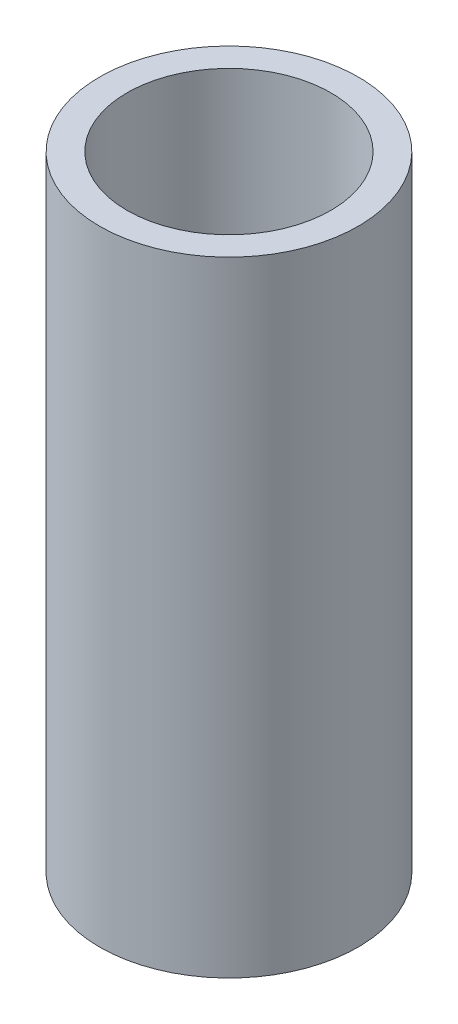
ISO-10303-21;
HEADER;
FILE_DESCRIPTION(('STEP AP214'),'2;1');
FILE_NAME('part.step','',(''),(''),'','','');
FILE_SCHEMA(('AUTOMOTIVE_DESIGN { 1 0 10303 214 1 1 1 1 }'));
ENDSEC;
DATA;
#1=APPLICATION_CONTEXT('core data for automotive mechanical design processes');
#2=APPLICATION_PROTOCOL_DEFINITION('international standard','automotive_design',2000,#1);
#3=PRODUCT_CONTEXT('',#1,'mechanical');
#4=PRODUCT('Part','Part','',(#3));
#5=PRODUCT_RELATED_PRODUCT_CATEGORY('part','',(#4));
#6=PRODUCT_DEFINITION_FORMATION('','',#4);
#7=PRODUCT_DEFINITION_CONTEXT('part definition',#1,'design');
#8=PRODUCT_DEFINITION('design','',#6,#7);
#9=PRODUCT_DEFINITION_SHAPE('','',#8);
#10=(LENGTH_UNIT() NAMED_UNIT(*) SI_UNIT(.MILLI.,.METRE.));
#11=(NAMED_UNIT(*) PLANE_ANGLE_UNIT() SI_UNIT($,.RADIAN.));
#12=(NAMED_UNIT(*) SI_UNIT($,.STERADIAN.) SOLID_ANGLE_UNIT());
#13=UNCERTAINTY_MEASURE_WITH_UNIT(LENGTH_MEASURE(1.E-05),#10,'distance_accuracy_value','');
#14=(GEOMETRIC_REPRESENTATION_CONTEXT(3) GLOBAL_UNCERTAINTY_ASSIGNED_CONTEXT((#13)) GLOBAL_UNIT_ASSIGNED_CONTEXT((#10,
#11,#12)) REPRESENTATION_CONTEXT('',''));
#15=CARTESIAN_POINT('',(0.,0.,0.));
#16=DIRECTION('',(0.,0.,1.));
#17=DIRECTION('',(1.,0.,0.));
#18=AXIS2_PLACEMENT_3D('',#15,#16,#17);
#19=CARTESIAN_POINT('',(0.,35.,0.));
#20=DIRECTION('',(0.,1.,0.));
#21=DIRECTION('',(0.,0.,1.));
#22=AXIS2_PLACEMENT_3D('',#19,#20,#21);
#23=PLANE('',#22);
#24=CARTESIAN_POINT('',(0.,35.,0.));
#25=DIRECTION('',(0.,1.,0.));
#26=DIRECTION('',(0.,0.,1.));
#27=AXIS2_PLACEMENT_3D('',#24,#25,#26);
#28=CIRCLE('',#27,14.5);
#29=CARTESIAN_POINT('',(0.,35.,14.5));
#30=VERTEX_POINT('',#29);
#31=EDGE_CURVE('E10',#30,#30,#28,.T.);
#32=ORIENTED_EDGE('',*,*,#31,.T.);
#33=EDGE_LOOP('',(#32));
#34=FACE_BOUND('',#33,.T.);
#35=CARTESIAN_POINT('',(0.,35.,0.));
#36=DIRECTION('',(0.,1.,0.));
#37=DIRECTION('',(0.,0.,1.));
#38=AXIS2_PLACEMENT_3D('',#35,#36,#37);
#39=CIRCLE('',#38,11.43);
#40=CARTESIAN_POINT('',(0.,35.,11.43));
#41=VERTEX_POINT('',#40);
#42=EDGE_CURVE('E48',#41,#41,#39,.T.);
#43=ORIENTED_EDGE('',*,*,#42,.F.);
#44=EDGE_LOOP('',(#43));
#45=FACE_BOUND('',#44,.T.);
#46=ADVANCED_FACE('F37',(#34,#45),#23,.T.);
#47=CARTESIAN_POINT('',(0.,-35.,0.));
#48=DIRECTION('',(0.,1.,0.));
#49=DIRECTION('',(0.,0.,1.));
#50=AXIS2_PLACEMENT_3D('',#47,#48,#49);
#51=PLANE('',#50);
#52=CARTESIAN_POINT('',(0.,-35.,0.));
#53=DIRECTION('',(0.,1.,0.));
#54=DIRECTION('',(0.,0.,1.));
#55=AXIS2_PLACEMENT_3D('',#52,#53,#54);
#56=CIRCLE('',#55,14.5);
#57=CARTESIAN_POINT('',(0.,-35.,14.5));
#58=VERTEX_POINT('',#57);
#59=EDGE_CURVE('E41',#58,#58,#56,.T.);
#60=ORIENTED_EDGE('',*,*,#59,.F.);
#61=EDGE_LOOP('',(#60));
#62=FACE_BOUND('',#61,.T.);
#63=CARTESIAN_POINT('',(0.,-35.,0.));
#64=DIRECTION('',(0.,1.,0.));
#65=DIRECTION('',(0.,0.,1.));
#66=AXIS2_PLACEMENT_3D('',#63,#64,#65);
#67=CIRCLE('',#66,11.43);
#68=CARTESIAN_POINT('',(0.,-35.,11.43));
#69=VERTEX_POINT('',#68);
#70=EDGE_CURVE('E50',#69,#69,#67,.T.);
#71=ORIENTED_EDGE('',*,*,#70,.T.);
#72=EDGE_LOOP('',(#71));
#73=FACE_BOUND('',#72,.T.);
#74=ADVANCED_FACE('F60',(#62,#73),#51,.F.);
#75=CARTESIAN_POINT('',(0.,35.,0.));
#76=DIRECTION('',(0.,-1.,0.));
#77=DIRECTION('',(0.,0.,-1.));
#78=AXIS2_PLACEMENT_3D('',#75,#76,#77);
#79=CYLINDRICAL_SURFACE('',#78,14.5);
#80=ORIENTED_EDGE('',*,*,#31,.F.);
#81=EDGE_LOOP('',(#80));
#82=FACE_BOUND('',#81,.T.);
#83=ORIENTED_EDGE('',*,*,#59,.T.);
#84=EDGE_LOOP('',(#83));
#85=FACE_BOUND('',#84,.T.);
#86=ADVANCED_FACE('F39',(#82,#85),#79,.T.);
#87=CARTESIAN_POINT('',(0.,35.,0.));
#88=DIRECTION('',(0.,-1.,0.));
#89=DIRECTION('',(0.,0.,-1.));
#90=AXIS2_PLACEMENT_3D('',#87,#88,#89);
#91=CYLINDRICAL_SURFACE('',#90,11.43);
#92=ORIENTED_EDGE('',*,*,#42,.T.);
#93=EDGE_LOOP('',(#92));
#94=FACE_BOUND('',#93,.T.);
#95=ORIENTED_EDGE('',*,*,#70,.F.);
#96=EDGE_LOOP('',(#95));
#97=FACE_BOUND('',#96,.T.);
#98=ADVANCED_FACE('F56',(#94,#97),#91,.F.);
#99=CLOSED_SHELL('',(#46,#74,#86,#98));
#100=MANIFOLD_SOLID_BREP('B2',#99);
#101=ADVANCED_BREP_SHAPE_REPRESENTATION('',(#18,#100),#14);
#102=SHAPE_DEFINITION_REPRESENTATION(#9,#101);
ENDSEC;
END-ISO-10303-21;
